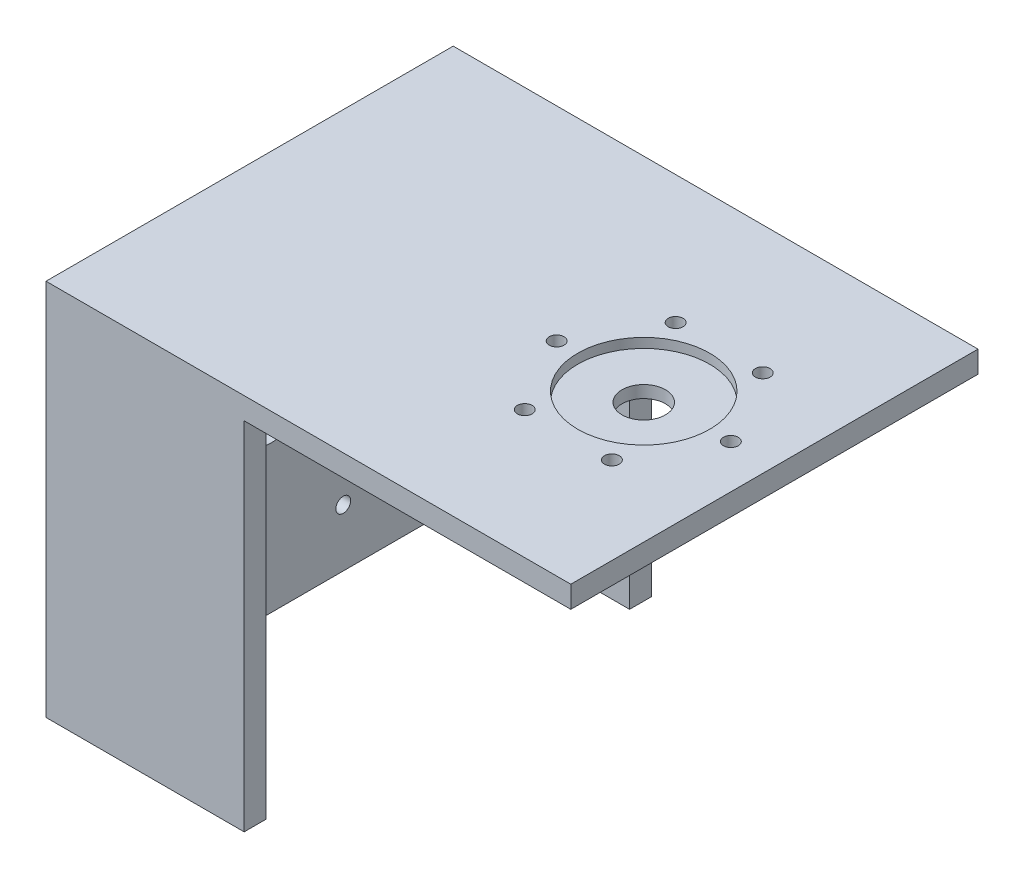
ISO-10303-21;
HEADER;
FILE_DESCRIPTION(('STEP AP214'),'2;1');
FILE_NAME('part.step','',(''),(''),'','','');
FILE_SCHEMA(('AUTOMOTIVE_DESIGN { 1 0 10303 214 1 1 1 1 }'));
ENDSEC;
DATA;
#1=APPLICATION_CONTEXT('core data for automotive mechanical design processes');
#2=APPLICATION_PROTOCOL_DEFINITION('international standard','automotive_design',2000,#1);
#3=PRODUCT_CONTEXT('',#1,'mechanical');
#4=PRODUCT('Part','Part','',(#3));
#5=PRODUCT_RELATED_PRODUCT_CATEGORY('part','',(#4));
#6=PRODUCT_DEFINITION_FORMATION('','',#4);
#7=PRODUCT_DEFINITION_CONTEXT('part definition',#1,'design');
#8=PRODUCT_DEFINITION('design','',#6,#7);
#9=PRODUCT_DEFINITION_SHAPE('','',#8);
#10=(LENGTH_UNIT() NAMED_UNIT(*) SI_UNIT(.MILLI.,.METRE.));
#11=(NAMED_UNIT(*) PLANE_ANGLE_UNIT() SI_UNIT($,.RADIAN.));
#12=(NAMED_UNIT(*) SI_UNIT($,.STERADIAN.) SOLID_ANGLE_UNIT());
#13=UNCERTAINTY_MEASURE_WITH_UNIT(LENGTH_MEASURE(1.E-05),#10,'distance_accuracy_value','');
#14=(GEOMETRIC_REPRESENTATION_CONTEXT(3) GLOBAL_UNCERTAINTY_ASSIGNED_CONTEXT((#13)) GLOBAL_UNIT_ASSIGNED_CONTEXT((#10,
#11,#12)) REPRESENTATION_CONTEXT('',''));
#15=CARTESIAN_POINT('',(0.,0.,0.));
#16=DIRECTION('',(0.,0.,1.));
#17=DIRECTION('',(1.,0.,0.));
#18=AXIS2_PLACEMENT_3D('',#15,#16,#17);
#19=CARTESIAN_POINT('',(0.,-5.,0.));
#20=DIRECTION('',(0.,-1.,0.));
#21=DIRECTION('',(0.,0.,-1.));
#22=AXIS2_PLACEMENT_3D('',#19,#20,#21);
#23=PLANE('',#22);
#24=CARTESIAN_POINT('',(10.,-5.,17.3205080756888));
#25=DIRECTION('',(0.,1.,0.));
#26=DIRECTION('',(0.,0.,1.));
#27=AXIS2_PLACEMENT_3D('',#24,#25,#26);
#28=CIRCLE('',#27,1.7);
#29=CARTESIAN_POINT('',(10.,-5.,19.0205080756888));
#30=VERTEX_POINT('',#29);
#31=EDGE_CURVE('E219',#30,#30,#28,.T.);
#32=ORIENTED_EDGE('',*,*,#31,.T.);
#33=EDGE_LOOP('',(#32));
#34=FACE_BOUND('',#33,.T.);
#35=CARTESIAN_POINT('',(-20.,-5.,0.));
#36=DIRECTION('',(0.,1.,0.));
#37=DIRECTION('',(0.,0.,1.));
#38=AXIS2_PLACEMENT_3D('',#35,#36,#37);
#39=CIRCLE('',#38,1.7);
#40=CARTESIAN_POINT('',(-20.,-5.,1.7));
#41=VERTEX_POINT('',#40);
#42=EDGE_CURVE('E229',#41,#41,#39,.T.);
#43=ORIENTED_EDGE('',*,*,#42,.T.);
#44=EDGE_LOOP('',(#43));
#45=FACE_BOUND('',#44,.T.);
#46=CARTESIAN_POINT('',(10.,-5.,-17.3205080756888));
#47=DIRECTION('',(0.,1.,0.));
#48=DIRECTION('',(0.,0.,1.));
#49=AXIS2_PLACEMENT_3D('',#46,#47,#48);
#50=CIRCLE('',#49,1.7);
#51=CARTESIAN_POINT('',(10.,-5.,-15.6205080756888));
#52=VERTEX_POINT('',#51);
#53=EDGE_CURVE('E245',#52,#52,#50,.T.);
#54=ORIENTED_EDGE('',*,*,#53,.T.);
#55=EDGE_LOOP('',(#54));
#56=FACE_BOUND('',#55,.T.);
#57=CARTESIAN_POINT('',(20.,-5.,0.));
#58=DIRECTION('',(0.,1.,0.));
#59=DIRECTION('',(0.,0.,1.));
#60=AXIS2_PLACEMENT_3D('',#57,#58,#59);
#61=CIRCLE('',#60,1.7);
#62=CARTESIAN_POINT('',(20.,-5.,1.7));
#63=VERTEX_POINT('',#62);
#64=EDGE_CURVE('E247',#63,#63,#61,.T.);
#65=ORIENTED_EDGE('',*,*,#64,.T.);
#66=EDGE_LOOP('',(#65));
#67=FACE_BOUND('',#66,.T.);
#68=CARTESIAN_POINT('',(-9.99999999999999,-5.,-17.3205080756888));
#69=DIRECTION('',(0.,1.,0.));
#70=DIRECTION('',(0.,0.,1.));
#71=AXIS2_PLACEMENT_3D('',#68,#69,#70);
#72=CIRCLE('',#71,1.7);
#73=CARTESIAN_POINT('',(-9.99999999999999,-5.,-15.6205080756888));
#74=VERTEX_POINT('',#73);
#75=EDGE_CURVE('E237',#74,#74,#72,.T.);
#76=ORIENTED_EDGE('',*,*,#75,.T.);
#77=EDGE_LOOP('',(#76));
#78=FACE_BOUND('',#77,.T.);
#79=CARTESIAN_POINT('',(-10.,-5.,17.3205080756888));
#80=DIRECTION('',(0.,1.,0.));
#81=DIRECTION('',(0.,0.,1.));
#82=AXIS2_PLACEMENT_3D('',#79,#80,#81);
#83=CIRCLE('',#82,1.7);
#84=CARTESIAN_POINT('',(-10.,-5.,19.0205080756888));
#85=VERTEX_POINT('',#84);
#86=EDGE_CURVE('E221',#85,#85,#83,.T.);
#87=ORIENTED_EDGE('',*,*,#86,.T.);
#88=EDGE_LOOP('',(#87));
#89=FACE_BOUND('',#88,.T.);
#90=CARTESIAN_POINT('',(0.,-5.,0.));
#91=DIRECTION('',(0.,1.,0.));
#92=DIRECTION('',(0.,0.,1.));
#93=AXIS2_PLACEMENT_3D('',#90,#91,#92);
#94=CIRCLE('',#93,5.);
#95=CARTESIAN_POINT('',(0.,-5.,5.));
#96=VERTEX_POINT('',#95);
#97=EDGE_CURVE('E220',#96,#96,#94,.T.);
#98=ORIENTED_EDGE('',*,*,#97,.T.);
#99=EDGE_LOOP('',(#98));
#100=FACE_BOUND('',#99,.T.);
#101=DIRECTION('',(1.,0.,0.));
#102=VECTOR('',#101,1.);
#103=CARTESIAN_POINT('',(0.,-5.,-41.75));
#104=LINE('',#103,#102);
#105=CARTESIAN_POINT('',(-85.5,-5.,-41.75));
#106=VERTEX_POINT('',#105);
#107=CARTESIAN_POINT('',(-45.,-5.,-41.75));
#108=VERTEX_POINT('',#107);
#109=EDGE_CURVE('E54',#106,#108,#104,.T.);
#110=ORIENTED_EDGE('',*,*,#109,.T.);
#111=DIRECTION('',(0.,0.,-1.));
#112=VECTOR('',#111,1.);
#113=CARTESIAN_POINT('',(-45.,-5.,0.));
#114=LINE('',#113,#112);
#115=CARTESIAN_POINT('',(-45.,-5.,-46.75));
#116=VERTEX_POINT('',#115);
#117=EDGE_CURVE('E56',#108,#116,#114,.T.);
#118=ORIENTED_EDGE('',*,*,#117,.T.);
#119=DIRECTION('',(-1.,0.,0.));
#120=VECTOR('',#119,1.);
#121=CARTESIAN_POINT('',(-90.5,-5.,-46.75));
#122=LINE('',#121,#120);
#123=CARTESIAN_POINT('',(30.,-5.,-46.75));
#124=VERTEX_POINT('',#123);
#125=EDGE_CURVE('E257',#124,#116,#122,.T.);
#126=ORIENTED_EDGE('',*,*,#125,.F.);
#127=DIRECTION('',(0.,0.,-1.));
#128=VECTOR('',#127,1.);
#129=CARTESIAN_POINT('',(30.,-5.,-46.75));
#130=LINE('',#129,#128);
#131=CARTESIAN_POINT('',(30.,-5.,46.75));
#132=VERTEX_POINT('',#131);
#133=EDGE_CURVE('E268',#132,#124,#130,.T.);
#134=ORIENTED_EDGE('',*,*,#133,.F.);
#135=DIRECTION('',(1.,0.,0.));
#136=VECTOR('',#135,1.);
#137=CARTESIAN_POINT('',(30.,-5.,46.75));
#138=LINE('',#137,#136);
#139=CARTESIAN_POINT('',(-45.,-5.,46.75));
#140=VERTEX_POINT('',#139);
#141=EDGE_CURVE('E255',#140,#132,#138,.T.);
#142=ORIENTED_EDGE('',*,*,#141,.F.);
#143=DIRECTION('',(0.,0.,-1.));
#144=VECTOR('',#143,1.);
#145=CARTESIAN_POINT('',(-45.,-5.,0.));
#146=LINE('',#145,#144);
#147=CARTESIAN_POINT('',(-45.,-5.,41.75));
#148=VERTEX_POINT('',#147);
#149=EDGE_CURVE('E160',#140,#148,#146,.T.);
#150=ORIENTED_EDGE('',*,*,#149,.T.);
#151=DIRECTION('',(1.,0.,0.));
#152=VECTOR('',#151,1.);
#153=CARTESIAN_POINT('',(0.,-5.,41.75));
#154=LINE('',#153,#152);
#155=CARTESIAN_POINT('',(-85.5,-5.,41.75));
#156=VERTEX_POINT('',#155);
#157=EDGE_CURVE('E154',#156,#148,#154,.T.);
#158=ORIENTED_EDGE('',*,*,#157,.F.);
#159=DIRECTION('',(0.,0.,-1.));
#160=VECTOR('',#159,1.);
#161=CARTESIAN_POINT('',(-85.5,-5.,0.));
#162=LINE('',#161,#160);
#163=EDGE_CURVE('E48',#156,#106,#162,.T.);
#164=ORIENTED_EDGE('',*,*,#163,.T.);
#165=EDGE_LOOP('',(#110,#118,#126,#134,#142,#150,#158,#164));
#166=FACE_BOUND('',#165,.T.);
#167=ADVANCED_FACE('F37',(#34,#45,#56,#67,#78,#89,#100,#166),#23,.T.);
#168=CARTESIAN_POINT('',(-85.5,0.,0.));
#169=DIRECTION('',(-1.,0.,0.));
#170=DIRECTION('',(0.,0.,1.));
#171=AXIS2_PLACEMENT_3D('',#168,#169,#170);
#172=PLANE('',#171);
#173=CARTESIAN_POINT('',(-85.5,-16.4211616751135,-16.5));
#174=DIRECTION('',(1.,0.,0.));
#175=DIRECTION('',(0.,0.,-1.));
#176=AXIS2_PLACEMENT_3D('',#173,#174,#175);
#177=CIRCLE('',#176,1.7);
#178=CARTESIAN_POINT('',(-85.5,-16.4211616751135,-18.2));
#179=VERTEX_POINT('',#178);
#180=EDGE_CURVE('E161',#179,#179,#177,.T.);
#181=ORIENTED_EDGE('',*,*,#180,.F.);
#182=EDGE_LOOP('',(#181));
#183=FACE_BOUND('',#182,.T.);
#184=CARTESIAN_POINT('',(-85.5,-16.4211616751135,16.5));
#185=DIRECTION('',(1.,0.,0.));
#186=DIRECTION('',(0.,0.,-1.));
#187=AXIS2_PLACEMENT_3D('',#184,#185,#186);
#188=CIRCLE('',#187,1.7);
#189=CARTESIAN_POINT('',(-85.5,-16.4211616751135,14.8));
#190=VERTEX_POINT('',#189);
#191=EDGE_CURVE('E170',#190,#190,#188,.T.);
#192=ORIENTED_EDGE('',*,*,#191,.F.);
#193=EDGE_LOOP('',(#192));
#194=FACE_BOUND('',#193,.T.);
#195=CARTESIAN_POINT('',(-85.5,-45.,33.));
#196=DIRECTION('',(1.,0.,0.));
#197=DIRECTION('',(0.,0.,-1.));
#198=AXIS2_PLACEMENT_3D('',#195,#196,#197);
#199=CIRCLE('',#198,1.7);
#200=CARTESIAN_POINT('',(-85.5,-45.,31.3));
#201=VERTEX_POINT('',#200);
#202=EDGE_CURVE('E172',#201,#201,#199,.T.);
#203=ORIENTED_EDGE('',*,*,#202,.F.);
#204=EDGE_LOOP('',(#203));
#205=FACE_BOUND('',#204,.T.);
#206=CARTESIAN_POINT('',(-85.5,-73.5788383248865,16.5));
#207=DIRECTION('',(1.,0.,0.));
#208=DIRECTION('',(0.,0.,-1.));
#209=AXIS2_PLACEMENT_3D('',#206,#207,#208);
#210=CIRCLE('',#209,1.7);
#211=CARTESIAN_POINT('',(-85.5,-73.5788383248865,14.8));
#212=VERTEX_POINT('',#211);
#213=EDGE_CURVE('E178',#212,#212,#210,.T.);
#214=ORIENTED_EDGE('',*,*,#213,.F.);
#215=EDGE_LOOP('',(#214));
#216=FACE_BOUND('',#215,.T.);
#217=CARTESIAN_POINT('',(-85.5,-73.5788383248865,-16.5));
#218=DIRECTION('',(1.,0.,0.));
#219=DIRECTION('',(0.,0.,-1.));
#220=AXIS2_PLACEMENT_3D('',#217,#218,#219);
#221=CIRCLE('',#220,1.7);
#222=CARTESIAN_POINT('',(-85.5,-73.5788383248865,-18.2));
#223=VERTEX_POINT('',#222);
#224=EDGE_CURVE('E183',#223,#223,#221,.T.);
#225=ORIENTED_EDGE('',*,*,#224,.F.);
#226=EDGE_LOOP('',(#225));
#227=FACE_BOUND('',#226,.T.);
#228=CARTESIAN_POINT('',(-85.5,-45.,-33.));
#229=DIRECTION('',(1.,0.,0.));
#230=DIRECTION('',(0.,0.,-1.));
#231=AXIS2_PLACEMENT_3D('',#228,#229,#230);
#232=CIRCLE('',#231,1.7);
#233=CARTESIAN_POINT('',(-85.5,-45.,-34.7));
#234=VERTEX_POINT('',#233);
#235=EDGE_CURVE('E191',#234,#234,#232,.T.);
#236=ORIENTED_EDGE('',*,*,#235,.F.);
#237=EDGE_LOOP('',(#236));
#238=FACE_BOUND('',#237,.T.);
#239=CARTESIAN_POINT('',(-85.5,-45.,0.));
#240=DIRECTION('',(1.,0.,0.));
#241=DIRECTION('',(0.,0.,-1.));
#242=AXIS2_PLACEMENT_3D('',#239,#240,#241);
#243=CIRCLE('',#242,8.);
#244=CARTESIAN_POINT('',(-85.5,-45.,-8.));
#245=VERTEX_POINT('',#244);
#246=EDGE_CURVE('E197',#245,#245,#243,.T.);
#247=ORIENTED_EDGE('',*,*,#246,.F.);
#248=EDGE_LOOP('',(#247));
#249=FACE_BOUND('',#248,.T.);
#250=DIRECTION('',(0.,-1.,0.));
#251=VECTOR('',#250,1.);
#252=CARTESIAN_POINT('',(-85.5,0.,-41.75));
#253=LINE('',#252,#251);
#254=CARTESIAN_POINT('',(-85.5,-86.75,-41.75));
#255=VERTEX_POINT('',#254);
#256=EDGE_CURVE('E124',#106,#255,#253,.T.);
#257=ORIENTED_EDGE('',*,*,#256,.F.);
#258=ORIENTED_EDGE('',*,*,#163,.F.);
#259=DIRECTION('',(0.,-1.,0.));
#260=VECTOR('',#259,1.);
#261=CARTESIAN_POINT('',(-85.5,0.,41.75));
#262=LINE('',#261,#260);
#263=CARTESIAN_POINT('',(-85.5,-86.75,41.75));
#264=VERTEX_POINT('',#263);
#265=EDGE_CURVE('E11',#156,#264,#262,.T.);
#266=ORIENTED_EDGE('',*,*,#265,.T.);
#267=DIRECTION('',(0.,0.,-1.));
#268=VECTOR('',#267,1.);
#269=CARTESIAN_POINT('',(-85.5,-86.75,-46.75));
#270=LINE('',#269,#268);
#271=EDGE_CURVE('E201',#264,#255,#270,.T.);
#272=ORIENTED_EDGE('',*,*,#271,.T.);
#273=EDGE_LOOP('',(#257,#258,#266,#272));
#274=FACE_BOUND('',#273,.T.);
#275=ADVANCED_FACE('F284',(#183,#194,#205,#216,#227,#238,#249,#274),#172,.F.);
#276=CARTESIAN_POINT('',(0.,0.,0.));
#277=DIRECTION('',(0.,-1.,0.));
#278=DIRECTION('',(0.,0.,-1.));
#279=AXIS2_PLACEMENT_3D('',#276,#277,#278);
#280=CYLINDRICAL_SURFACE('',#279,5.);
#281=ORIENTED_EDGE('',*,*,#97,.F.);
#282=EDGE_LOOP('',(#281));
#283=FACE_BOUND('',#282,.T.);
#284=CARTESIAN_POINT('',(0.,-2.2,0.));
#285=DIRECTION('',(0.,1.,0.));
#286=DIRECTION('',(0.,0.,1.));
#287=AXIS2_PLACEMENT_3D('',#284,#285,#286);
#288=CIRCLE('',#287,5.);
#289=CARTESIAN_POINT('',(0.,-2.2,5.));
#290=VERTEX_POINT('',#289);
#291=EDGE_CURVE('E212',#290,#290,#288,.T.);
#292=ORIENTED_EDGE('',*,*,#291,.T.);
#293=EDGE_LOOP('',(#292));
#294=FACE_BOUND('',#293,.T.);
#295=ADVANCED_FACE('F306',(#283,#294),#280,.F.);
#296=CARTESIAN_POINT('',(0.,0.,0.));
#297=DIRECTION('',(0.,-1.,0.));
#298=DIRECTION('',(0.,0.,-1.));
#299=AXIS2_PLACEMENT_3D('',#296,#297,#298);
#300=PLANE('',#299);
#301=DIRECTION('',(0.,0.,1.));
#302=VECTOR('',#301,1.);
#303=CARTESIAN_POINT('',(-90.5,0.,46.75));
#304=LINE('',#303,#302);
#305=CARTESIAN_POINT('',(-90.5,0.,-46.75));
#306=VERTEX_POINT('',#305);
#307=CARTESIAN_POINT('',(-90.5,0.,46.75));
#308=VERTEX_POINT('',#307);
#309=EDGE_CURVE('E260',#306,#308,#304,.T.);
#310=ORIENTED_EDGE('',*,*,#309,.T.);
#311=DIRECTION('',(1.,0.,0.));
#312=VECTOR('',#311,1.);
#313=CARTESIAN_POINT('',(30.,0.,46.75));
#314=LINE('',#313,#312);
#315=CARTESIAN_POINT('',(30.,0.,46.75));
#316=VERTEX_POINT('',#315);
#317=EDGE_CURVE('E259',#308,#316,#314,.T.);
#318=ORIENTED_EDGE('',*,*,#317,.T.);
#319=DIRECTION('',(0.,0.,-1.));
#320=VECTOR('',#319,1.);
#321=CARTESIAN_POINT('',(30.,0.,-46.75));
#322=LINE('',#321,#320);
#323=CARTESIAN_POINT('',(30.,0.,-46.75));
#324=VERTEX_POINT('',#323);
#325=EDGE_CURVE('E265',#316,#324,#322,.T.);
#326=ORIENTED_EDGE('',*,*,#325,.T.);
#327=DIRECTION('',(-1.,0.,0.));
#328=VECTOR('',#327,1.);
#329=CARTESIAN_POINT('',(-90.5,0.,-46.75));
#330=LINE('',#329,#328);
#331=EDGE_CURVE('E262',#324,#306,#330,.T.);
#332=ORIENTED_EDGE('',*,*,#331,.T.);
#333=EDGE_LOOP('',(#310,#318,#326,#332));
#334=FACE_BOUND('',#333,.T.);
#335=CARTESIAN_POINT('',(10.,0.,17.3205080756888));
#336=DIRECTION('',(0.,1.,0.));
#337=DIRECTION('',(0.,0.,1.));
#338=AXIS2_PLACEMENT_3D('',#335,#336,#337);
#339=CIRCLE('',#338,1.7);
#340=CARTESIAN_POINT('',(10.,0.,19.0205080756888));
#341=VERTEX_POINT('',#340);
#342=EDGE_CURVE('E222',#341,#341,#339,.T.);
#343=ORIENTED_EDGE('',*,*,#342,.F.);
#344=EDGE_LOOP('',(#343));
#345=FACE_BOUND('',#344,.T.);
#346=CARTESIAN_POINT('',(-10.,0.,17.3205080756888));
#347=DIRECTION('',(0.,1.,0.));
#348=DIRECTION('',(0.,0.,1.));
#349=AXIS2_PLACEMENT_3D('',#346,#347,#348);
#350=CIRCLE('',#349,1.7);
#351=CARTESIAN_POINT('',(-10.,0.,19.0205080756888));
#352=VERTEX_POINT('',#351);
#353=EDGE_CURVE('E230',#352,#352,#350,.T.);
#354=ORIENTED_EDGE('',*,*,#353,.F.);
#355=EDGE_LOOP('',(#354));
#356=FACE_BOUND('',#355,.T.);
#357=CARTESIAN_POINT('',(-20.,0.,0.));
#358=DIRECTION('',(0.,1.,0.));
#359=DIRECTION('',(0.,0.,1.));
#360=AXIS2_PLACEMENT_3D('',#357,#358,#359);
#361=CIRCLE('',#360,1.7);
#362=CARTESIAN_POINT('',(-20.,0.,1.7));
#363=VERTEX_POINT('',#362);
#364=EDGE_CURVE('E234',#363,#363,#361,.T.);
#365=ORIENTED_EDGE('',*,*,#364,.F.);
#366=EDGE_LOOP('',(#365));
#367=FACE_BOUND('',#366,.T.);
#368=CARTESIAN_POINT('',(-9.99999999999999,0.,-17.3205080756888));
#369=DIRECTION('',(0.,1.,0.));
#370=DIRECTION('',(0.,0.,1.));
#371=AXIS2_PLACEMENT_3D('',#368,#369,#370);
#372=CIRCLE('',#371,1.7);
#373=CARTESIAN_POINT('',(-9.99999999999999,0.,-15.6205080756888));
#374=VERTEX_POINT('',#373);
#375=EDGE_CURVE('E239',#374,#374,#372,.T.);
#376=ORIENTED_EDGE('',*,*,#375,.F.);
#377=EDGE_LOOP('',(#376));
#378=FACE_BOUND('',#377,.T.);
#379=CARTESIAN_POINT('',(10.,0.,-17.3205080756888));
#380=DIRECTION('',(0.,1.,0.));
#381=DIRECTION('',(0.,0.,1.));
#382=AXIS2_PLACEMENT_3D('',#379,#380,#381);
#383=CIRCLE('',#382,1.7);
#384=CARTESIAN_POINT('',(10.,0.,-15.6205080756888));
#385=VERTEX_POINT('',#384);
#386=EDGE_CURVE('E244',#385,#385,#383,.T.);
#387=ORIENTED_EDGE('',*,*,#386,.F.);
#388=EDGE_LOOP('',(#387));
#389=FACE_BOUND('',#388,.T.);
#390=CARTESIAN_POINT('',(20.,0.,0.));
#391=DIRECTION('',(0.,1.,0.));
#392=DIRECTION('',(0.,0.,1.));
#393=AXIS2_PLACEMENT_3D('',#390,#391,#392);
#394=CIRCLE('',#393,1.7);
#395=CARTESIAN_POINT('',(20.,0.,1.7));
#396=VERTEX_POINT('',#395);
#397=EDGE_CURVE('E253',#396,#396,#394,.T.);
#398=ORIENTED_EDGE('',*,*,#397,.F.);
#399=EDGE_LOOP('',(#398));
#400=FACE_BOUND('',#399,.T.);
#401=CARTESIAN_POINT('',(0.,0.,0.));
#402=DIRECTION('',(0.,1.,0.));
#403=DIRECTION('',(0.,0.,1.));
#404=AXIS2_PLACEMENT_3D('',#401,#402,#403);
#405=CIRCLE('',#404,15.15);
#406=CARTESIAN_POINT('',(0.,0.,15.15));
#407=VERTEX_POINT('',#406);
#408=EDGE_CURVE('E209',#407,#407,#405,.T.);
#409=ORIENTED_EDGE('',*,*,#408,.F.);
#410=EDGE_LOOP('',(#409));
#411=FACE_BOUND('',#410,.T.);
#412=ADVANCED_FACE('F314',(#334,#345,#356,#367,#378,#389,#400,#411),#300,.F.);
#413=CARTESIAN_POINT('',(-90.5,0.,46.75));
#414=DIRECTION('',(1.,0.,0.));
#415=DIRECTION('',(0.,0.,-1.));
#416=AXIS2_PLACEMENT_3D('',#413,#414,#415);
#417=PLANE('',#416);
#418=DIRECTION('',(0.,-1.,0.));
#419=VECTOR('',#418,1.);
#420=CARTESIAN_POINT('',(-90.5,0.,46.75));
#421=LINE('',#420,#419);
#422=CARTESIAN_POINT('',(-90.5,-86.75,46.75));
#423=VERTEX_POINT('',#422);
#424=EDGE_CURVE('E276',#308,#423,#421,.T.);
#425=ORIENTED_EDGE('',*,*,#424,.F.);
#426=ORIENTED_EDGE('',*,*,#309,.F.);
#427=DIRECTION('',(0.,-1.,0.));
#428=VECTOR('',#427,1.);
#429=CARTESIAN_POINT('',(-90.5,0.,-46.75));
#430=LINE('',#429,#428);
#431=CARTESIAN_POINT('',(-90.5,-86.75,-46.75));
#432=VERTEX_POINT('',#431);
#433=EDGE_CURVE('E266',#306,#432,#430,.T.);
#434=ORIENTED_EDGE('',*,*,#433,.T.);
#435=DIRECTION('',(0.,0.,-1.));
#436=VECTOR('',#435,1.);
#437=CARTESIAN_POINT('',(-90.5,-86.75,-46.75));
#438=LINE('',#437,#436);
#439=EDGE_CURVE('E199',#423,#432,#438,.T.);
#440=ORIENTED_EDGE('',*,*,#439,.F.);
#441=EDGE_LOOP('',(#425,#426,#434,#440));
#442=FACE_BOUND('',#441,.T.);
#443=CARTESIAN_POINT('',(-90.5,-16.4211616751135,16.5));
#444=DIRECTION('',(1.,0.,0.));
#445=DIRECTION('',(0.,0.,-1.));
#446=AXIS2_PLACEMENT_3D('',#443,#444,#445);
#447=CIRCLE('',#446,1.7);
#448=CARTESIAN_POINT('',(-90.5,-16.4211616751135,14.8));
#449=VERTEX_POINT('',#448);
#450=EDGE_CURVE('E163',#449,#449,#447,.T.);
#451=ORIENTED_EDGE('',*,*,#450,.T.);
#452=EDGE_LOOP('',(#451));
#453=FACE_BOUND('',#452,.T.);
#454=CARTESIAN_POINT('',(-90.5,-73.5788383248865,16.5));
#455=DIRECTION('',(1.,0.,0.));
#456=DIRECTION('',(0.,0.,-1.));
#457=AXIS2_PLACEMENT_3D('',#454,#455,#456);
#458=CIRCLE('',#457,1.7);
#459=CARTESIAN_POINT('',(-90.5,-73.5788383248865,14.8));
#460=VERTEX_POINT('',#459);
#461=EDGE_CURVE('E176',#460,#460,#458,.T.);
#462=ORIENTED_EDGE('',*,*,#461,.T.);
#463=EDGE_LOOP('',(#462));
#464=FACE_BOUND('',#463,.T.);
#465=CARTESIAN_POINT('',(-90.5,-45.,-33.));
#466=DIRECTION('',(1.,0.,0.));
#467=DIRECTION('',(0.,0.,-1.));
#468=AXIS2_PLACEMENT_3D('',#465,#466,#467);
#469=CIRCLE('',#468,1.7);
#470=CARTESIAN_POINT('',(-90.5,-45.,-34.7));
#471=VERTEX_POINT('',#470);
#472=EDGE_CURVE('E187',#471,#471,#469,.T.);
#473=ORIENTED_EDGE('',*,*,#472,.T.);
#474=EDGE_LOOP('',(#473));
#475=FACE_BOUND('',#474,.T.);
#476=CARTESIAN_POINT('',(-90.5,-45.,0.));
#477=DIRECTION('',(1.,0.,0.));
#478=DIRECTION('',(0.,0.,-1.));
#479=AXIS2_PLACEMENT_3D('',#476,#477,#478);
#480=CIRCLE('',#479,8.);
#481=CARTESIAN_POINT('',(-90.5,-45.,-8.));
#482=VERTEX_POINT('',#481);
#483=EDGE_CURVE('E193',#482,#482,#480,.T.);
#484=ORIENTED_EDGE('',*,*,#483,.T.);
#485=EDGE_LOOP('',(#484));
#486=FACE_BOUND('',#485,.T.);
#487=CARTESIAN_POINT('',(-90.5,-73.5788383248865,-16.5));
#488=DIRECTION('',(1.,0.,0.));
#489=DIRECTION('',(0.,0.,-1.));
#490=AXIS2_PLACEMENT_3D('',#487,#488,#489);
#491=CIRCLE('',#490,1.7);
#492=CARTESIAN_POINT('',(-90.5,-73.5788383248865,-18.2));
#493=VERTEX_POINT('',#492);
#494=EDGE_CURVE('E185',#493,#493,#491,.T.);
#495=ORIENTED_EDGE('',*,*,#494,.T.);
#496=EDGE_LOOP('',(#495));
#497=FACE_BOUND('',#496,.T.);
#498=CARTESIAN_POINT('',(-90.5,-45.,33.));
#499=DIRECTION('',(1.,0.,0.));
#500=DIRECTION('',(0.,0.,-1.));
#501=AXIS2_PLACEMENT_3D('',#498,#499,#500);
#502=CIRCLE('',#501,1.7);
#503=CARTESIAN_POINT('',(-90.5,-45.,31.3));
#504=VERTEX_POINT('',#503);
#505=EDGE_CURVE('E168',#504,#504,#502,.T.);
#506=ORIENTED_EDGE('',*,*,#505,.T.);
#507=EDGE_LOOP('',(#506));
#508=FACE_BOUND('',#507,.T.);
#509=CARTESIAN_POINT('',(-90.5,-16.4211616751135,-16.5));
#510=DIRECTION('',(1.,0.,0.));
#511=DIRECTION('',(0.,0.,-1.));
#512=AXIS2_PLACEMENT_3D('',#509,#510,#511);
#513=CIRCLE('',#512,1.7);
#514=CARTESIAN_POINT('',(-90.5,-16.4211616751135,-18.2));
#515=VERTEX_POINT('',#514);
#516=EDGE_CURVE('E159',#515,#515,#513,.T.);
#517=ORIENTED_EDGE('',*,*,#516,.T.);
#518=EDGE_LOOP('',(#517));
#519=FACE_BOUND('',#518,.T.);
#520=ADVANCED_FACE('F45',(#442,#453,#464,#475,#486,#497,#508,#519),#417,.F.);
#521=CARTESIAN_POINT('',(30.,0.,46.75));
#522=DIRECTION('',(0.,0.,-1.));
#523=DIRECTION('',(-1.,0.,0.));
#524=AXIS2_PLACEMENT_3D('',#521,#522,#523);
#525=PLANE('',#524);
#526=DIRECTION('',(-1.,0.,0.));
#527=VECTOR('',#526,1.);
#528=CARTESIAN_POINT('',(-85.5,-86.75,46.75));
#529=LINE('',#528,#527);
#530=CARTESIAN_POINT('',(-45.,-86.75,46.75));
#531=VERTEX_POINT('',#530);
#532=EDGE_CURVE('E210',#531,#423,#529,.T.);
#533=ORIENTED_EDGE('',*,*,#532,.F.);
#534=DIRECTION('',(0.,1.,0.));
#535=VECTOR('',#534,1.);
#536=CARTESIAN_POINT('',(-45.,0.,46.75));
#537=LINE('',#536,#535);
#538=EDGE_CURVE('E144',#531,#140,#537,.T.);
#539=ORIENTED_EDGE('',*,*,#538,.T.);
#540=ORIENTED_EDGE('',*,*,#141,.T.);
#541=DIRECTION('',(0.,-1.,0.));
#542=VECTOR('',#541,1.);
#543=CARTESIAN_POINT('',(30.,0.,46.75));
#544=LINE('',#543,#542);
#545=EDGE_CURVE('E277',#316,#132,#544,.T.);
#546=ORIENTED_EDGE('',*,*,#545,.F.);
#547=ORIENTED_EDGE('',*,*,#317,.F.);
#548=ORIENTED_EDGE('',*,*,#424,.T.);
#549=EDGE_LOOP('',(#533,#539,#540,#546,#547,#548));
#550=FACE_BOUND('',#549,.T.);
#551=ADVANCED_FACE('F323',(#550),#525,.F.);
#552=CARTESIAN_POINT('',(30.,0.,-46.75));
#553=DIRECTION('',(-1.,0.,0.));
#554=DIRECTION('',(0.,0.,1.));
#555=AXIS2_PLACEMENT_3D('',#552,#553,#554);
#556=PLANE('',#555);
#557=ORIENTED_EDGE('',*,*,#133,.T.);
#558=DIRECTION('',(0.,-1.,0.));
#559=VECTOR('',#558,1.);
#560=CARTESIAN_POINT('',(30.,0.,-46.75));
#561=LINE('',#560,#559);
#562=EDGE_CURVE('E272',#324,#124,#561,.T.);
#563=ORIENTED_EDGE('',*,*,#562,.F.);
#564=ORIENTED_EDGE('',*,*,#325,.F.);
#565=ORIENTED_EDGE('',*,*,#545,.T.);
#566=EDGE_LOOP('',(#557,#563,#564,#565));
#567=FACE_BOUND('',#566,.T.);
#568=ADVANCED_FACE('F319',(#567),#556,.F.);
#569=CARTESIAN_POINT('',(-90.5,0.,-46.75));
#570=DIRECTION('',(0.,0.,1.));
#571=DIRECTION('',(1.,0.,0.));
#572=AXIS2_PLACEMENT_3D('',#569,#570,#571);
#573=PLANE('',#572);
#574=ORIENTED_EDGE('',*,*,#125,.T.);
#575=DIRECTION('',(0.,1.,0.));
#576=VECTOR('',#575,1.);
#577=CARTESIAN_POINT('',(-45.,0.,-46.75));
#578=LINE('',#577,#576);
#579=CARTESIAN_POINT('',(-45.,-86.75,-46.75));
#580=VERTEX_POINT('',#579);
#581=EDGE_CURVE('E127',#580,#116,#578,.T.);
#582=ORIENTED_EDGE('',*,*,#581,.F.);
#583=DIRECTION('',(-1.,0.,0.));
#584=VECTOR('',#583,1.);
#585=CARTESIAN_POINT('',(-85.5,-86.75,-46.75));
#586=LINE('',#585,#584);
#587=EDGE_CURVE('E135',#580,#432,#586,.T.);
#588=ORIENTED_EDGE('',*,*,#587,.T.);
#589=ORIENTED_EDGE('',*,*,#433,.F.);
#590=ORIENTED_EDGE('',*,*,#331,.F.);
#591=ORIENTED_EDGE('',*,*,#562,.T.);
#592=EDGE_LOOP('',(#574,#582,#588,#589,#590,#591));
#593=FACE_BOUND('',#592,.T.);
#594=ADVANCED_FACE('F316',(#593),#573,.F.);
#595=CARTESIAN_POINT('',(20.,0.,0.));
#596=DIRECTION('',(0.,-1.,0.));
#597=DIRECTION('',(0.,0.,-1.));
#598=AXIS2_PLACEMENT_3D('',#595,#596,#597);
#599=CYLINDRICAL_SURFACE('',#598,1.7);
#600=ORIENTED_EDGE('',*,*,#397,.T.);
#601=EDGE_LOOP('',(#600));
#602=FACE_BOUND('',#601,.T.);
#603=ORIENTED_EDGE('',*,*,#64,.F.);
#604=EDGE_LOOP('',(#603));
#605=FACE_BOUND('',#604,.T.);
#606=ADVANCED_FACE('F317',(#602,#605),#599,.F.);
#607=CARTESIAN_POINT('',(10.,0.,-17.3205080756888));
#608=DIRECTION('',(0.,-1.,0.));
#609=DIRECTION('',(0.,0.,-1.));
#610=AXIS2_PLACEMENT_3D('',#607,#608,#609);
#611=CYLINDRICAL_SURFACE('',#610,1.7);
#612=ORIENTED_EDGE('',*,*,#386,.T.);
#613=EDGE_LOOP('',(#612));
#614=FACE_BOUND('',#613,.T.);
#615=ORIENTED_EDGE('',*,*,#53,.F.);
#616=EDGE_LOOP('',(#615));
#617=FACE_BOUND('',#616,.T.);
#618=ADVANCED_FACE('F395',(#614,#617),#611,.F.);
#619=CARTESIAN_POINT('',(-9.99999999999999,0.,-17.3205080756888));
#620=DIRECTION('',(0.,-1.,0.));
#621=DIRECTION('',(0.,0.,-1.));
#622=AXIS2_PLACEMENT_3D('',#619,#620,#621);
#623=CYLINDRICAL_SURFACE('',#622,1.7);
#624=ORIENTED_EDGE('',*,*,#375,.T.);
#625=EDGE_LOOP('',(#624));
#626=FACE_BOUND('',#625,.T.);
#627=ORIENTED_EDGE('',*,*,#75,.F.);
#628=EDGE_LOOP('',(#627));
#629=FACE_BOUND('',#628,.T.);
#630=ADVANCED_FACE('F389',(#626,#629),#623,.F.);
#631=CARTESIAN_POINT('',(-20.,0.,0.));
#632=DIRECTION('',(0.,-1.,0.));
#633=DIRECTION('',(0.,0.,-1.));
#634=AXIS2_PLACEMENT_3D('',#631,#632,#633);
#635=CYLINDRICAL_SURFACE('',#634,1.7);
#636=ORIENTED_EDGE('',*,*,#364,.T.);
#637=EDGE_LOOP('',(#636));
#638=FACE_BOUND('',#637,.T.);
#639=ORIENTED_EDGE('',*,*,#42,.F.);
#640=EDGE_LOOP('',(#639));
#641=FACE_BOUND('',#640,.T.);
#642=ADVANCED_FACE('F383',(#638,#641),#635,.F.);
#643=CARTESIAN_POINT('',(-10.,0.,17.3205080756888));
#644=DIRECTION('',(0.,-1.,0.));
#645=DIRECTION('',(0.,0.,-1.));
#646=AXIS2_PLACEMENT_3D('',#643,#644,#645);
#647=CYLINDRICAL_SURFACE('',#646,1.7);
#648=ORIENTED_EDGE('',*,*,#353,.T.);
#649=EDGE_LOOP('',(#648));
#650=FACE_BOUND('',#649,.T.);
#651=ORIENTED_EDGE('',*,*,#86,.F.);
#652=EDGE_LOOP('',(#651));
#653=FACE_BOUND('',#652,.T.);
#654=ADVANCED_FACE('F372',(#650,#653),#647,.F.);
#655=CARTESIAN_POINT('',(10.,0.,17.3205080756888));
#656=DIRECTION('',(0.,-1.,0.));
#657=DIRECTION('',(0.,0.,-1.));
#658=AXIS2_PLACEMENT_3D('',#655,#656,#657);
#659=CYLINDRICAL_SURFACE('',#658,1.7);
#660=ORIENTED_EDGE('',*,*,#342,.T.);
#661=EDGE_LOOP('',(#660));
#662=FACE_BOUND('',#661,.T.);
#663=ORIENTED_EDGE('',*,*,#31,.F.);
#664=EDGE_LOOP('',(#663));
#665=FACE_BOUND('',#664,.T.);
#666=ADVANCED_FACE('F365',(#662,#665),#659,.F.);
#667=CARTESIAN_POINT('',(0.,-2.2,0.));
#668=DIRECTION('',(0.,1.,0.));
#669=DIRECTION('',(0.,0.,1.));
#670=AXIS2_PLACEMENT_3D('',#667,#668,#669);
#671=CYLINDRICAL_SURFACE('',#670,15.15);
#672=CARTESIAN_POINT('',(0.,-2.2,0.));
#673=DIRECTION('',(0.,1.,0.));
#674=DIRECTION('',(0.,0.,1.));
#675=AXIS2_PLACEMENT_3D('',#672,#673,#674);
#676=CIRCLE('',#675,15.15);
#677=CARTESIAN_POINT('',(0.,-2.2,15.15));
#678=VERTEX_POINT('',#677);
#679=EDGE_CURVE('E211',#678,#678,#676,.T.);
#680=ORIENTED_EDGE('',*,*,#679,.F.);
#681=EDGE_LOOP('',(#680));
#682=FACE_BOUND('',#681,.T.);
#683=ORIENTED_EDGE('',*,*,#408,.T.);
#684=EDGE_LOOP('',(#683));
#685=FACE_BOUND('',#684,.T.);
#686=ADVANCED_FACE('F363',(#682,#685),#671,.F.);
#687=CARTESIAN_POINT('',(0.,-2.2,0.));
#688=DIRECTION('',(0.,1.,0.));
#689=DIRECTION('',(0.,0.,1.));
#690=AXIS2_PLACEMENT_3D('',#687,#688,#689);
#691=PLANE('',#690);
#692=ORIENTED_EDGE('',*,*,#291,.F.);
#693=EDGE_LOOP('',(#692));
#694=FACE_BOUND('',#693,.T.);
#695=ORIENTED_EDGE('',*,*,#679,.T.);
#696=EDGE_LOOP('',(#695));
#697=FACE_BOUND('',#696,.T.);
#698=ADVANCED_FACE('F361',(#694,#697),#691,.T.);
#699=CARTESIAN_POINT('',(-85.5,-86.75,-46.75));
#700=DIRECTION('',(0.,1.,0.));
#701=DIRECTION('',(0.,0.,1.));
#702=AXIS2_PLACEMENT_3D('',#699,#700,#701);
#703=PLANE('',#702);
#704=ORIENTED_EDGE('',*,*,#439,.T.);
#705=ORIENTED_EDGE('',*,*,#587,.F.);
#706=DIRECTION('',(0.,0.,-1.));
#707=VECTOR('',#706,1.);
#708=CARTESIAN_POINT('',(-45.,-86.75,-41.75));
#709=LINE('',#708,#707);
#710=CARTESIAN_POINT('',(-45.,-86.75,-41.75));
#711=VERTEX_POINT('',#710);
#712=EDGE_CURVE('E129',#711,#580,#709,.T.);
#713=ORIENTED_EDGE('',*,*,#712,.F.);
#714=DIRECTION('',(1.,0.,0.));
#715=VECTOR('',#714,1.);
#716=CARTESIAN_POINT('',(-45.,-86.75,-41.75));
#717=LINE('',#716,#715);
#718=EDGE_CURVE('E117',#255,#711,#717,.T.);
#719=ORIENTED_EDGE('',*,*,#718,.F.);
#720=ORIENTED_EDGE('',*,*,#271,.F.);
#721=DIRECTION('',(1.,0.,0.));
#722=VECTOR('',#721,1.);
#723=CARTESIAN_POINT('',(-45.,-86.75,41.75));
#724=LINE('',#723,#722);
#725=CARTESIAN_POINT('',(-45.,-86.75,41.75));
#726=VERTEX_POINT('',#725);
#727=EDGE_CURVE('E145',#264,#726,#724,.T.);
#728=ORIENTED_EDGE('',*,*,#727,.T.);
#729=DIRECTION('',(0.,0.,-1.));
#730=VECTOR('',#729,1.);
#731=CARTESIAN_POINT('',(-45.,-86.75,46.75));
#732=LINE('',#731,#730);
#733=EDGE_CURVE('E146',#531,#726,#732,.T.);
#734=ORIENTED_EDGE('',*,*,#733,.F.);
#735=ORIENTED_EDGE('',*,*,#532,.T.);
#736=EDGE_LOOP('',(#704,#705,#713,#719,#720,#728,#734,#735));
#737=FACE_BOUND('',#736,.T.);
#738=ADVANCED_FACE('F128',(#737),#703,.F.);
#739=CARTESIAN_POINT('',(-85.5,-45.,0.));
#740=DIRECTION('',(-1.,0.,0.));
#741=DIRECTION('',(0.,0.,1.));
#742=AXIS2_PLACEMENT_3D('',#739,#740,#741);
#743=CYLINDRICAL_SURFACE('',#742,8.);
#744=ORIENTED_EDGE('',*,*,#246,.T.);
#745=EDGE_LOOP('',(#744));
#746=FACE_BOUND('',#745,.T.);
#747=ORIENTED_EDGE('',*,*,#483,.F.);
#748=EDGE_LOOP('',(#747));
#749=FACE_BOUND('',#748,.T.);
#750=ADVANCED_FACE('F470',(#746,#749),#743,.F.);
#751=CARTESIAN_POINT('',(-85.5,-45.,-33.));
#752=DIRECTION('',(-1.,0.,0.));
#753=DIRECTION('',(0.,0.,1.));
#754=AXIS2_PLACEMENT_3D('',#751,#752,#753);
#755=CYLINDRICAL_SURFACE('',#754,1.7);
#756=ORIENTED_EDGE('',*,*,#235,.T.);
#757=EDGE_LOOP('',(#756));
#758=FACE_BOUND('',#757,.T.);
#759=ORIENTED_EDGE('',*,*,#472,.F.);
#760=EDGE_LOOP('',(#759));
#761=FACE_BOUND('',#760,.T.);
#762=ADVANCED_FACE('F478',(#758,#761),#755,.F.);
#763=CARTESIAN_POINT('',(-85.5,-73.5788383248865,-16.5));
#764=DIRECTION('',(-1.,0.,0.));
#765=DIRECTION('',(0.,0.,1.));
#766=AXIS2_PLACEMENT_3D('',#763,#764,#765);
#767=CYLINDRICAL_SURFACE('',#766,1.7);
#768=ORIENTED_EDGE('',*,*,#224,.T.);
#769=EDGE_LOOP('',(#768));
#770=FACE_BOUND('',#769,.T.);
#771=ORIENTED_EDGE('',*,*,#494,.F.);
#772=EDGE_LOOP('',(#771));
#773=FACE_BOUND('',#772,.T.);
#774=ADVANCED_FACE('F484',(#770,#773),#767,.F.);
#775=CARTESIAN_POINT('',(-85.5,-73.5788383248865,16.5));
#776=DIRECTION('',(-1.,0.,0.));
#777=DIRECTION('',(0.,0.,1.));
#778=AXIS2_PLACEMENT_3D('',#775,#776,#777);
#779=CYLINDRICAL_SURFACE('',#778,1.7);
#780=ORIENTED_EDGE('',*,*,#213,.T.);
#781=EDGE_LOOP('',(#780));
#782=FACE_BOUND('',#781,.T.);
#783=ORIENTED_EDGE('',*,*,#461,.F.);
#784=EDGE_LOOP('',(#783));
#785=FACE_BOUND('',#784,.T.);
#786=ADVANCED_FACE('F493',(#782,#785),#779,.F.);
#787=CARTESIAN_POINT('',(-85.5,-45.,33.));
#788=DIRECTION('',(-1.,0.,0.));
#789=DIRECTION('',(0.,0.,1.));
#790=AXIS2_PLACEMENT_3D('',#787,#788,#789);
#791=CYLINDRICAL_SURFACE('',#790,1.7);
#792=ORIENTED_EDGE('',*,*,#202,.T.);
#793=EDGE_LOOP('',(#792));
#794=FACE_BOUND('',#793,.T.);
#795=ORIENTED_EDGE('',*,*,#505,.F.);
#796=EDGE_LOOP('',(#795));
#797=FACE_BOUND('',#796,.T.);
#798=ADVANCED_FACE('F502',(#794,#797),#791,.F.);
#799=CARTESIAN_POINT('',(-85.5,-16.4211616751135,16.5));
#800=DIRECTION('',(-1.,0.,0.));
#801=DIRECTION('',(0.,0.,1.));
#802=AXIS2_PLACEMENT_3D('',#799,#800,#801);
#803=CYLINDRICAL_SURFACE('',#802,1.7);
#804=ORIENTED_EDGE('',*,*,#191,.T.);
#805=EDGE_LOOP('',(#804));
#806=FACE_BOUND('',#805,.T.);
#807=ORIENTED_EDGE('',*,*,#450,.F.);
#808=EDGE_LOOP('',(#807));
#809=FACE_BOUND('',#808,.T.);
#810=ADVANCED_FACE('F515',(#806,#809),#803,.F.);
#811=CARTESIAN_POINT('',(-85.5,-16.4211616751135,-16.5));
#812=DIRECTION('',(-1.,0.,0.));
#813=DIRECTION('',(0.,0.,1.));
#814=AXIS2_PLACEMENT_3D('',#811,#812,#813);
#815=CYLINDRICAL_SURFACE('',#814,1.7);
#816=ORIENTED_EDGE('',*,*,#180,.T.);
#817=EDGE_LOOP('',(#816));
#818=FACE_BOUND('',#817,.T.);
#819=ORIENTED_EDGE('',*,*,#516,.F.);
#820=EDGE_LOOP('',(#819));
#821=FACE_BOUND('',#820,.T.);
#822=ADVANCED_FACE('F301',(#818,#821),#815,.F.);
#823=CARTESIAN_POINT('',(-45.,0.,46.75));
#824=DIRECTION('',(-1.,0.,0.));
#825=DIRECTION('',(0.,0.,1.));
#826=AXIS2_PLACEMENT_3D('',#823,#824,#825);
#827=PLANE('',#826);
#828=ORIENTED_EDGE('',*,*,#149,.F.);
#829=ORIENTED_EDGE('',*,*,#538,.F.);
#830=ORIENTED_EDGE('',*,*,#733,.T.);
#831=DIRECTION('',(0.,1.,0.));
#832=VECTOR('',#831,1.);
#833=CARTESIAN_POINT('',(-45.,0.,41.75));
#834=LINE('',#833,#832);
#835=EDGE_CURVE('E149',#726,#148,#834,.T.);
#836=ORIENTED_EDGE('',*,*,#835,.T.);
#837=EDGE_LOOP('',(#828,#829,#830,#836));
#838=FACE_BOUND('',#837,.T.);
#839=ADVANCED_FACE('F292',(#838),#827,.F.);
#840=CARTESIAN_POINT('',(0.,0.,41.75));
#841=DIRECTION('',(0.,0.,-1.));
#842=DIRECTION('',(-1.,0.,0.));
#843=AXIS2_PLACEMENT_3D('',#840,#841,#842);
#844=PLANE('',#843);
#845=ORIENTED_EDGE('',*,*,#265,.F.);
#846=ORIENTED_EDGE('',*,*,#157,.T.);
#847=ORIENTED_EDGE('',*,*,#835,.F.);
#848=ORIENTED_EDGE('',*,*,#727,.F.);
#849=EDGE_LOOP('',(#845,#846,#847,#848));
#850=FACE_BOUND('',#849,.T.);
#851=ADVANCED_FACE('F295',(#850),#844,.T.);
#852=CARTESIAN_POINT('',(-45.,0.,-41.75));
#853=DIRECTION('',(-1.,0.,0.));
#854=DIRECTION('',(0.,0.,1.));
#855=AXIS2_PLACEMENT_3D('',#852,#853,#854);
#856=PLANE('',#855);
#857=ORIENTED_EDGE('',*,*,#117,.F.);
#858=DIRECTION('',(0.,1.,0.));
#859=VECTOR('',#858,1.);
#860=CARTESIAN_POINT('',(-45.,0.,-41.75));
#861=LINE('',#860,#859);
#862=EDGE_CURVE('E122',#711,#108,#861,.T.);
#863=ORIENTED_EDGE('',*,*,#862,.F.);
#864=ORIENTED_EDGE('',*,*,#712,.T.);
#865=ORIENTED_EDGE('',*,*,#581,.T.);
#866=EDGE_LOOP('',(#857,#863,#864,#865));
#867=FACE_BOUND('',#866,.T.);
#868=ADVANCED_FACE('F140',(#867),#856,.F.);
#869=CARTESIAN_POINT('',(0.,0.,-41.75));
#870=DIRECTION('',(0.,0.,-1.));
#871=DIRECTION('',(-1.,0.,0.));
#872=AXIS2_PLACEMENT_3D('',#869,#870,#871);
#873=PLANE('',#872);
#874=ORIENTED_EDGE('',*,*,#109,.F.);
#875=ORIENTED_EDGE('',*,*,#256,.T.);
#876=ORIENTED_EDGE('',*,*,#718,.T.);
#877=ORIENTED_EDGE('',*,*,#862,.T.);
#878=EDGE_LOOP('',(#874,#875,#876,#877));
#879=FACE_BOUND('',#878,.T.);
#880=ADVANCED_FACE('F119',(#879),#873,.F.);
#881=CLOSED_SHELL('',(#167,#275,#295,#412,#520,#551,#568,#594,#606,#618,#630,#642,#654,#666,
#686,#698,#738,#750,#762,#774,#786,#798,#810,#822,#839,#851,#868,#880));
#882=MANIFOLD_SOLID_BREP('B2',#881);
#883=ADVANCED_BREP_SHAPE_REPRESENTATION('',(#18,#882),#14);
#884=SHAPE_DEFINITION_REPRESENTATION(#9,#883);
ENDSEC;
END-ISO-10303-21;
